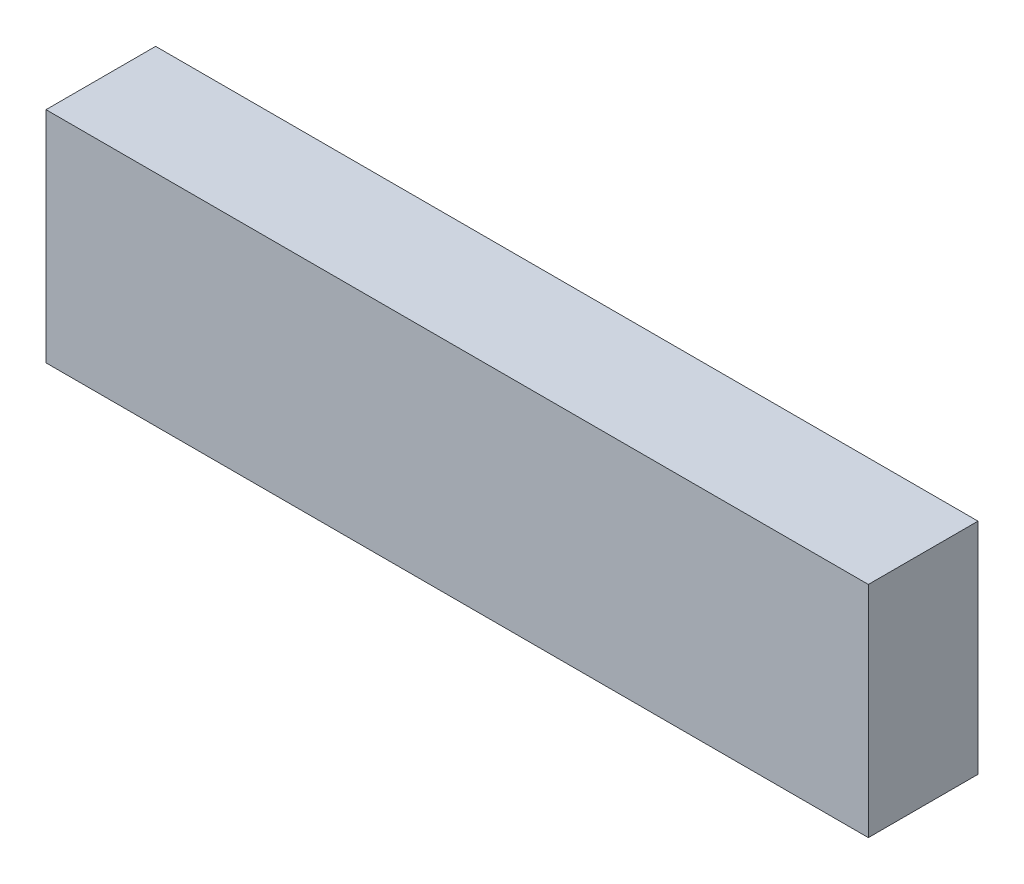
ISO-10303-21;
HEADER;
FILE_DESCRIPTION(('STEP AP214'),'2;1');
FILE_NAME('part.step','',(''),(''),'','','');
FILE_SCHEMA(('AUTOMOTIVE_DESIGN { 1 0 10303 214 1 1 1 1 }'));
ENDSEC;
DATA;
#1=APPLICATION_CONTEXT('core data for automotive mechanical design processes');
#2=APPLICATION_PROTOCOL_DEFINITION('international standard','automotive_design',2000,#1);
#3=PRODUCT_CONTEXT('',#1,'mechanical');
#4=PRODUCT('Part','Part','',(#3));
#5=PRODUCT_RELATED_PRODUCT_CATEGORY('part','',(#4));
#6=PRODUCT_DEFINITION_FORMATION('','',#4);
#7=PRODUCT_DEFINITION_CONTEXT('part definition',#1,'design');
#8=PRODUCT_DEFINITION('design','',#6,#7);
#9=PRODUCT_DEFINITION_SHAPE('','',#8);
#10=(LENGTH_UNIT() NAMED_UNIT(*) SI_UNIT(.MILLI.,.METRE.));
#11=(NAMED_UNIT(*) PLANE_ANGLE_UNIT() SI_UNIT($,.RADIAN.));
#12=(NAMED_UNIT(*) SI_UNIT($,.STERADIAN.) SOLID_ANGLE_UNIT());
#13=UNCERTAINTY_MEASURE_WITH_UNIT(LENGTH_MEASURE(1.E-05),#10,'distance_accuracy_value','');
#14=(GEOMETRIC_REPRESENTATION_CONTEXT(3) GLOBAL_UNCERTAINTY_ASSIGNED_CONTEXT((#13)) GLOBAL_UNIT_ASSIGNED_CONTEXT((#10,
#11,#12)) REPRESENTATION_CONTEXT('',''));
#15=CARTESIAN_POINT('',(0.,0.,0.));
#16=DIRECTION('',(0.,0.,1.));
#17=DIRECTION('',(1.,0.,0.));
#18=AXIS2_PLACEMENT_3D('',#15,#16,#17);
#19=CARTESIAN_POINT('',(-15.,9.,-2.));
#20=DIRECTION('',(1.,0.,0.));
#21=DIRECTION('',(0.,0.,-1.));
#22=AXIS2_PLACEMENT_3D('',#19,#20,#21);
#23=PLANE('',#22);
#24=DIRECTION('',(0.,0.,1.));
#25=VECTOR('',#24,1.);
#26=CARTESIAN_POINT('',(-15.,1.,-2.));
#27=LINE('',#26,#25);
#28=CARTESIAN_POINT('',(-15.,1.,-2.));
#29=VERTEX_POINT('',#28);
#30=CARTESIAN_POINT('',(-15.,1.,2.));
#31=VERTEX_POINT('',#30);
#32=EDGE_CURVE('E96',#29,#31,#27,.T.);
#33=ORIENTED_EDGE('',*,*,#32,.T.);
#34=DIRECTION('',(0.,-1.,0.));
#35=VECTOR('',#34,1.);
#36=CARTESIAN_POINT('',(-15.,9.,2.));
#37=LINE('',#36,#35);
#38=CARTESIAN_POINT('',(-15.,9.,2.));
#39=VERTEX_POINT('',#38);
#40=EDGE_CURVE('E11',#39,#31,#37,.T.);
#41=ORIENTED_EDGE('',*,*,#40,.F.);
#42=DIRECTION('',(0.,0.,1.));
#43=VECTOR('',#42,1.);
#44=CARTESIAN_POINT('',(-15.,9.,-2.));
#45=LINE('',#44,#43);
#46=CARTESIAN_POINT('',(-15.,9.,-2.));
#47=VERTEX_POINT('',#46);
#48=EDGE_CURVE('E84',#47,#39,#45,.T.);
#49=ORIENTED_EDGE('',*,*,#48,.F.);
#50=DIRECTION('',(0.,-1.,0.));
#51=VECTOR('',#50,1.);
#52=CARTESIAN_POINT('',(-15.,9.,-2.));
#53=LINE('',#52,#51);
#54=EDGE_CURVE('E92',#47,#29,#53,.T.);
#55=ORIENTED_EDGE('',*,*,#54,.T.);
#56=EDGE_LOOP('',(#33,#41,#49,#55));
#57=FACE_BOUND('',#56,.T.);
#58=ADVANCED_FACE('F33',(#57),#23,.F.);
#59=CARTESIAN_POINT('',(-15.,9.,2.));
#60=DIRECTION('',(0.,0.,-1.));
#61=DIRECTION('',(-1.,0.,0.));
#62=AXIS2_PLACEMENT_3D('',#59,#60,#61);
#63=PLANE('',#62);
#64=DIRECTION('',(1.,0.,0.));
#65=VECTOR('',#64,1.);
#66=CARTESIAN_POINT('',(-15.,1.,2.));
#67=LINE('',#66,#65);
#68=CARTESIAN_POINT('',(15.,1.,2.));
#69=VERTEX_POINT('',#68);
#70=EDGE_CURVE('E88',#31,#69,#67,.T.);
#71=ORIENTED_EDGE('',*,*,#70,.T.);
#72=DIRECTION('',(0.,-1.,0.));
#73=VECTOR('',#72,1.);
#74=CARTESIAN_POINT('',(15.,9.,2.));
#75=LINE('',#74,#73);
#76=CARTESIAN_POINT('',(15.,9.,2.));
#77=VERTEX_POINT('',#76);
#78=EDGE_CURVE('E41',#77,#69,#75,.T.);
#79=ORIENTED_EDGE('',*,*,#78,.F.);
#80=DIRECTION('',(1.,0.,0.));
#81=VECTOR('',#80,1.);
#82=CARTESIAN_POINT('',(-15.,9.,2.));
#83=LINE('',#82,#81);
#84=EDGE_CURVE('E79',#39,#77,#83,.T.);
#85=ORIENTED_EDGE('',*,*,#84,.F.);
#86=ORIENTED_EDGE('',*,*,#40,.T.);
#87=EDGE_LOOP('',(#71,#79,#85,#86));
#88=FACE_BOUND('',#87,.T.);
#89=ADVANCED_FACE('F87',(#88),#63,.F.);
#90=CARTESIAN_POINT('',(15.,9.,-2.));
#91=DIRECTION('',(-1.,0.,0.));
#92=DIRECTION('',(0.,0.,1.));
#93=AXIS2_PLACEMENT_3D('',#90,#91,#92);
#94=PLANE('',#93);
#95=DIRECTION('',(0.,0.,-1.));
#96=VECTOR('',#95,1.);
#97=CARTESIAN_POINT('',(15.,1.,-2.));
#98=LINE('',#97,#96);
#99=CARTESIAN_POINT('',(15.,1.,-2.));
#100=VERTEX_POINT('',#99);
#101=EDGE_CURVE('E66',#69,#100,#98,.T.);
#102=ORIENTED_EDGE('',*,*,#101,.T.);
#103=DIRECTION('',(0.,-1.,0.));
#104=VECTOR('',#103,1.);
#105=CARTESIAN_POINT('',(15.,9.,-2.));
#106=LINE('',#105,#104);
#107=CARTESIAN_POINT('',(15.,9.,-2.));
#108=VERTEX_POINT('',#107);
#109=EDGE_CURVE('E89',#108,#100,#106,.T.);
#110=ORIENTED_EDGE('',*,*,#109,.F.);
#111=DIRECTION('',(0.,0.,-1.));
#112=VECTOR('',#111,1.);
#113=CARTESIAN_POINT('',(15.,9.,-2.));
#114=LINE('',#113,#112);
#115=EDGE_CURVE('E82',#77,#108,#114,.T.);
#116=ORIENTED_EDGE('',*,*,#115,.F.);
#117=ORIENTED_EDGE('',*,*,#78,.T.);
#118=EDGE_LOOP('',(#102,#110,#116,#117));
#119=FACE_BOUND('',#118,.T.);
#120=ADVANCED_FACE('F90',(#119),#94,.F.);
#121=CARTESIAN_POINT('',(-15.,9.,-2.));
#122=DIRECTION('',(0.,0.,1.));
#123=DIRECTION('',(1.,0.,0.));
#124=AXIS2_PLACEMENT_3D('',#121,#122,#123);
#125=PLANE('',#124);
#126=DIRECTION('',(-1.,0.,0.));
#127=VECTOR('',#126,1.);
#128=CARTESIAN_POINT('',(-15.,1.,-2.));
#129=LINE('',#128,#127);
#130=EDGE_CURVE('E72',#100,#29,#129,.T.);
#131=ORIENTED_EDGE('',*,*,#130,.T.);
#132=ORIENTED_EDGE('',*,*,#54,.F.);
#133=DIRECTION('',(-1.,0.,0.));
#134=VECTOR('',#133,1.);
#135=CARTESIAN_POINT('',(-15.,9.,-2.));
#136=LINE('',#135,#134);
#137=EDGE_CURVE('E49',#108,#47,#136,.T.);
#138=ORIENTED_EDGE('',*,*,#137,.F.);
#139=ORIENTED_EDGE('',*,*,#109,.T.);
#140=EDGE_LOOP('',(#131,#132,#138,#139));
#141=FACE_BOUND('',#140,.T.);
#142=ADVANCED_FACE('F103',(#141),#125,.F.);
#143=CARTESIAN_POINT('',(0.,9.,0.));
#144=DIRECTION('',(0.,1.,0.));
#145=DIRECTION('',(0.,0.,1.));
#146=AXIS2_PLACEMENT_3D('',#143,#144,#145);
#147=PLANE('',#146);
#148=ORIENTED_EDGE('',*,*,#48,.T.);
#149=ORIENTED_EDGE('',*,*,#84,.T.);
#150=ORIENTED_EDGE('',*,*,#115,.T.);
#151=ORIENTED_EDGE('',*,*,#137,.T.);
#152=EDGE_LOOP('',(#148,#149,#150,#151));
#153=FACE_BOUND('',#152,.T.);
#154=ADVANCED_FACE('F80',(#153),#147,.T.);
#155=CARTESIAN_POINT('',(0.,1.,0.));
#156=DIRECTION('',(0.,1.,0.));
#157=DIRECTION('',(0.,0.,1.));
#158=AXIS2_PLACEMENT_3D('',#155,#156,#157);
#159=PLANE('',#158);
#160=ORIENTED_EDGE('',*,*,#32,.F.);
#161=ORIENTED_EDGE('',*,*,#130,.F.);
#162=ORIENTED_EDGE('',*,*,#101,.F.);
#163=ORIENTED_EDGE('',*,*,#70,.F.);
#164=EDGE_LOOP('',(#160,#161,#162,#163));
#165=FACE_BOUND('',#164,.T.);
#166=ADVANCED_FACE('F106',(#165),#159,.F.);
#167=CLOSED_SHELL('',(#58,#89,#120,#142,#154,#166));
#168=MANIFOLD_SOLID_BREP('B2',#167);
#169=ADVANCED_BREP_SHAPE_REPRESENTATION('',(#18,#168),#14);
#170=SHAPE_DEFINITION_REPRESENTATION(#9,#169);
ENDSEC;
END-ISO-10303-21;
